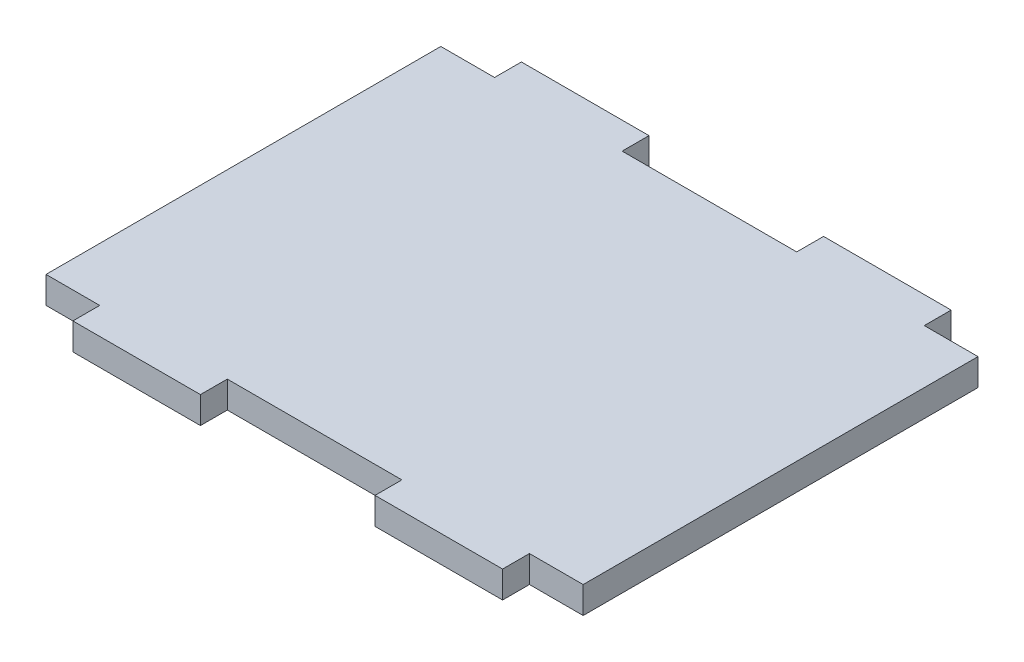
ISO-10303-21;
HEADER;
FILE_DESCRIPTION(('STEP AP214'),'2;1');
FILE_NAME('part.step','',(''),(''),'','','');
FILE_SCHEMA(('AUTOMOTIVE_DESIGN { 1 0 10303 214 1 1 1 1 }'));
ENDSEC;
DATA;
#1=APPLICATION_CONTEXT('core data for automotive mechanical design processes');
#2=APPLICATION_PROTOCOL_DEFINITION('international standard','automotive_design',2000,#1);
#3=PRODUCT_CONTEXT('',#1,'mechanical');
#4=PRODUCT('Part','Part','',(#3));
#5=PRODUCT_RELATED_PRODUCT_CATEGORY('part','',(#4));
#6=PRODUCT_DEFINITION_FORMATION('','',#4);
#7=PRODUCT_DEFINITION_CONTEXT('part definition',#1,'design');
#8=PRODUCT_DEFINITION('design','',#6,#7);
#9=PRODUCT_DEFINITION_SHAPE('','',#8);
#10=(LENGTH_UNIT() NAMED_UNIT(*) SI_UNIT(.MILLI.,.METRE.));
#11=(NAMED_UNIT(*) PLANE_ANGLE_UNIT() SI_UNIT($,.RADIAN.));
#12=(NAMED_UNIT(*) SI_UNIT($,.STERADIAN.) SOLID_ANGLE_UNIT());
#13=UNCERTAINTY_MEASURE_WITH_UNIT(LENGTH_MEASURE(1.E-05),#10,'distance_accuracy_value','');
#14=(GEOMETRIC_REPRESENTATION_CONTEXT(3) GLOBAL_UNCERTAINTY_ASSIGNED_CONTEXT((#13)) GLOBAL_UNIT_ASSIGNED_CONTEXT((#10,
#11,#12)) REPRESENTATION_CONTEXT('',''));
#15=CARTESIAN_POINT('',(0.,0.,0.));
#16=DIRECTION('',(0.,0.,1.));
#17=DIRECTION('',(1.,0.,0.));
#18=AXIS2_PLACEMENT_3D('',#15,#16,#17);
#19=CARTESIAN_POINT('',(-20.,2.,0.));
#20=DIRECTION('',(-1.,0.,0.));
#21=DIRECTION('',(0.,0.,1.));
#22=AXIS2_PLACEMENT_3D('',#19,#20,#21);
#23=PLANE('',#22);
#24=DIRECTION('',(0.,0.,-1.));
#25=VECTOR('',#24,1.);
#26=CARTESIAN_POINT('',(-20.,0.,0.));
#27=LINE('',#26,#25);
#28=CARTESIAN_POINT('',(-20.,0.,14.7));
#29=VERTEX_POINT('',#28);
#30=CARTESIAN_POINT('',(-20.,0.,-14.7));
#31=VERTEX_POINT('',#30);
#32=EDGE_CURVE('E201',#29,#31,#27,.T.);
#33=ORIENTED_EDGE('',*,*,#32,.F.);
#34=DIRECTION('',(0.,-1.,0.));
#35=VECTOR('',#34,1.);
#36=CARTESIAN_POINT('',(-20.,2.,14.7));
#37=LINE('',#36,#35);
#38=CARTESIAN_POINT('',(-20.,2.,14.7));
#39=VERTEX_POINT('',#38);
#40=EDGE_CURVE('E11',#39,#29,#37,.T.);
#41=ORIENTED_EDGE('',*,*,#40,.F.);
#42=DIRECTION('',(0.,0.,-1.));
#43=VECTOR('',#42,1.);
#44=CARTESIAN_POINT('',(-20.,2.,0.));
#45=LINE('',#44,#43);
#46=CARTESIAN_POINT('',(-20.,2.,-14.7));
#47=VERTEX_POINT('',#46);
#48=EDGE_CURVE('E305',#39,#47,#45,.T.);
#49=ORIENTED_EDGE('',*,*,#48,.T.);
#50=DIRECTION('',(0.,-1.,0.));
#51=VECTOR('',#50,1.);
#52=CARTESIAN_POINT('',(-20.,2.,-14.7));
#53=LINE('',#52,#51);
#54=EDGE_CURVE('E49',#47,#31,#53,.T.);
#55=ORIENTED_EDGE('',*,*,#54,.T.);
#56=EDGE_LOOP('',(#33,#41,#49,#55));
#57=FACE_BOUND('',#56,.T.);
#58=ADVANCED_FACE('F33',(#57),#23,.T.);
#59=CARTESIAN_POINT('',(0.,2.,14.7));
#60=DIRECTION('',(0.,0.,-1.));
#61=DIRECTION('',(-1.,0.,0.));
#62=AXIS2_PLACEMENT_3D('',#59,#60,#61);
#63=PLANE('',#62);
#64=DIRECTION('',(1.,0.,0.));
#65=VECTOR('',#64,1.);
#66=CARTESIAN_POINT('',(0.,0.,14.7));
#67=LINE('',#66,#65);
#68=CARTESIAN_POINT('',(-16.,0.,14.7));
#69=VERTEX_POINT('',#68);
#70=EDGE_CURVE('E203',#29,#69,#67,.T.);
#71=ORIENTED_EDGE('',*,*,#70,.T.);
#72=DIRECTION('',(0.,-1.,0.));
#73=VECTOR('',#72,1.);
#74=CARTESIAN_POINT('',(-16.,2.,14.7));
#75=LINE('',#74,#73);
#76=CARTESIAN_POINT('',(-16.,2.,14.7));
#77=VERTEX_POINT('',#76);
#78=EDGE_CURVE('E41',#77,#69,#75,.T.);
#79=ORIENTED_EDGE('',*,*,#78,.F.);
#80=DIRECTION('',(1.,0.,0.));
#81=VECTOR('',#80,1.);
#82=CARTESIAN_POINT('',(0.,2.,14.7));
#83=LINE('',#82,#81);
#84=EDGE_CURVE('E301',#39,#77,#83,.T.);
#85=ORIENTED_EDGE('',*,*,#84,.F.);
#86=ORIENTED_EDGE('',*,*,#40,.T.);
#87=EDGE_LOOP('',(#71,#79,#85,#86));
#88=FACE_BOUND('',#87,.T.);
#89=ADVANCED_FACE('F289',(#88),#63,.F.);
#90=CARTESIAN_POINT('',(-16.,2.,0.));
#91=DIRECTION('',(-1.,0.,0.));
#92=DIRECTION('',(0.,0.,1.));
#93=AXIS2_PLACEMENT_3D('',#90,#91,#92);
#94=PLANE('',#93);
#95=DIRECTION('',(0.,0.,-1.));
#96=VECTOR('',#95,1.);
#97=CARTESIAN_POINT('',(-16.,0.,0.));
#98=LINE('',#97,#96);
#99=CARTESIAN_POINT('',(-16.,0.,16.7));
#100=VERTEX_POINT('',#99);
#101=EDGE_CURVE('E206',#100,#69,#98,.T.);
#102=ORIENTED_EDGE('',*,*,#101,.F.);
#103=DIRECTION('',(0.,-1.,0.));
#104=VECTOR('',#103,1.);
#105=CARTESIAN_POINT('',(-16.,2.,16.7));
#106=LINE('',#105,#104);
#107=CARTESIAN_POINT('',(-16.,2.,16.7));
#108=VERTEX_POINT('',#107);
#109=EDGE_CURVE('E279',#108,#100,#106,.T.);
#110=ORIENTED_EDGE('',*,*,#109,.F.);
#111=DIRECTION('',(0.,0.,-1.));
#112=VECTOR('',#111,1.);
#113=CARTESIAN_POINT('',(-16.,2.,0.));
#114=LINE('',#113,#112);
#115=EDGE_CURVE('E286',#108,#77,#114,.T.);
#116=ORIENTED_EDGE('',*,*,#115,.T.);
#117=ORIENTED_EDGE('',*,*,#78,.T.);
#118=EDGE_LOOP('',(#102,#110,#116,#117));
#119=FACE_BOUND('',#118,.T.);
#120=ADVANCED_FACE('F284',(#119),#94,.T.);
#121=CARTESIAN_POINT('',(0.,2.,16.7));
#122=DIRECTION('',(0.,0.,1.));
#123=DIRECTION('',(1.,0.,0.));
#124=AXIS2_PLACEMENT_3D('',#121,#122,#123);
#125=PLANE('',#124);
#126=DIRECTION('',(-1.,0.,0.));
#127=VECTOR('',#126,1.);
#128=CARTESIAN_POINT('',(0.,0.,16.7));
#129=LINE('',#128,#127);
#130=CARTESIAN_POINT('',(-6.5,0.,16.7));
#131=VERTEX_POINT('',#130);
#132=EDGE_CURVE('E211',#131,#100,#129,.T.);
#133=ORIENTED_EDGE('',*,*,#132,.F.);
#134=DIRECTION('',(0.,-1.,0.));
#135=VECTOR('',#134,1.);
#136=CARTESIAN_POINT('',(-6.5,2.,16.7));
#137=LINE('',#136,#135);
#138=CARTESIAN_POINT('',(-6.5,2.,16.7));
#139=VERTEX_POINT('',#138);
#140=EDGE_CURVE('E277',#139,#131,#137,.T.);
#141=ORIENTED_EDGE('',*,*,#140,.F.);
#142=DIRECTION('',(-1.,0.,0.));
#143=VECTOR('',#142,1.);
#144=CARTESIAN_POINT('',(0.,2.,16.7));
#145=LINE('',#144,#143);
#146=EDGE_CURVE('E300',#139,#108,#145,.T.);
#147=ORIENTED_EDGE('',*,*,#146,.T.);
#148=ORIENTED_EDGE('',*,*,#109,.T.);
#149=EDGE_LOOP('',(#133,#141,#147,#148));
#150=FACE_BOUND('',#149,.T.);
#151=ADVANCED_FACE('F296',(#150),#125,.T.);
#152=CARTESIAN_POINT('',(-6.5,2.,0.));
#153=DIRECTION('',(-1.,0.,0.));
#154=DIRECTION('',(0.,0.,1.));
#155=AXIS2_PLACEMENT_3D('',#152,#153,#154);
#156=PLANE('',#155);
#157=DIRECTION('',(0.,0.,-1.));
#158=VECTOR('',#157,1.);
#159=CARTESIAN_POINT('',(-6.5,0.,0.));
#160=LINE('',#159,#158);
#161=CARTESIAN_POINT('',(-6.5,0.,14.7));
#162=VERTEX_POINT('',#161);
#163=EDGE_CURVE('E214',#131,#162,#160,.T.);
#164=ORIENTED_EDGE('',*,*,#163,.T.);
#165=DIRECTION('',(0.,-1.,0.));
#166=VECTOR('',#165,1.);
#167=CARTESIAN_POINT('',(-6.5,2.,14.7));
#168=LINE('',#167,#166);
#169=CARTESIAN_POINT('',(-6.5,2.,14.7));
#170=VERTEX_POINT('',#169);
#171=EDGE_CURVE('E274',#170,#162,#168,.T.);
#172=ORIENTED_EDGE('',*,*,#171,.F.);
#173=DIRECTION('',(0.,0.,-1.));
#174=VECTOR('',#173,1.);
#175=CARTESIAN_POINT('',(-6.5,2.,0.));
#176=LINE('',#175,#174);
#177=EDGE_CURVE('E303',#139,#170,#176,.T.);
#178=ORIENTED_EDGE('',*,*,#177,.F.);
#179=ORIENTED_EDGE('',*,*,#140,.T.);
#180=EDGE_LOOP('',(#164,#172,#178,#179));
#181=FACE_BOUND('',#180,.T.);
#182=ADVANCED_FACE('F377',(#181),#156,.F.);
#183=CARTESIAN_POINT('',(6.50000000000001,0.,14.7));
#184=VERTEX_POINT('',#183);
#185=EDGE_CURVE('E208',#162,#184,#67,.T.);
#186=ORIENTED_EDGE('',*,*,#185,.T.);
#187=DIRECTION('',(0.,-1.,0.));
#188=VECTOR('',#187,1.);
#189=CARTESIAN_POINT('',(6.50000000000001,2.,14.7));
#190=LINE('',#189,#188);
#191=CARTESIAN_POINT('',(6.50000000000001,2.,14.7));
#192=VERTEX_POINT('',#191);
#193=EDGE_CURVE('E272',#192,#184,#190,.T.);
#194=ORIENTED_EDGE('',*,*,#193,.F.);
#195=EDGE_CURVE('E308',#170,#192,#83,.T.);
#196=ORIENTED_EDGE('',*,*,#195,.F.);
#197=ORIENTED_EDGE('',*,*,#171,.T.);
#198=EDGE_LOOP('',(#186,#194,#196,#197));
#199=FACE_BOUND('',#198,.T.);
#200=ADVANCED_FACE('F368',(#199),#63,.F.);
#201=CARTESIAN_POINT('',(6.50000000000001,2.,0.));
#202=DIRECTION('',(-1.,0.,0.));
#203=DIRECTION('',(0.,0.,1.));
#204=AXIS2_PLACEMENT_3D('',#201,#202,#203);
#205=PLANE('',#204);
#206=DIRECTION('',(0.,0.,-1.));
#207=VECTOR('',#206,1.);
#208=CARTESIAN_POINT('',(6.50000000000001,0.,0.));
#209=LINE('',#208,#207);
#210=CARTESIAN_POINT('',(6.50000000000001,0.,16.7));
#211=VERTEX_POINT('',#210);
#212=EDGE_CURVE('E216',#211,#184,#209,.T.);
#213=ORIENTED_EDGE('',*,*,#212,.F.);
#214=DIRECTION('',(0.,-1.,0.));
#215=VECTOR('',#214,1.);
#216=CARTESIAN_POINT('',(6.50000000000001,2.,16.7));
#217=LINE('',#216,#215);
#218=CARTESIAN_POINT('',(6.50000000000001,2.,16.7));
#219=VERTEX_POINT('',#218);
#220=EDGE_CURVE('E270',#219,#211,#217,.T.);
#221=ORIENTED_EDGE('',*,*,#220,.F.);
#222=DIRECTION('',(0.,0.,-1.));
#223=VECTOR('',#222,1.);
#224=CARTESIAN_POINT('',(6.50000000000001,2.,0.));
#225=LINE('',#224,#223);
#226=EDGE_CURVE('E312',#219,#192,#225,.T.);
#227=ORIENTED_EDGE('',*,*,#226,.T.);
#228=ORIENTED_EDGE('',*,*,#193,.T.);
#229=EDGE_LOOP('',(#213,#221,#227,#228));
#230=FACE_BOUND('',#229,.T.);
#231=ADVANCED_FACE('F376',(#230),#205,.T.);
#232=CARTESIAN_POINT('',(0.,2.,16.7));
#233=DIRECTION('',(0.,0.,1.));
#234=DIRECTION('',(1.,0.,0.));
#235=AXIS2_PLACEMENT_3D('',#232,#233,#234);
#236=PLANE('',#235);
#237=DIRECTION('',(-1.,0.,0.));
#238=VECTOR('',#237,1.);
#239=CARTESIAN_POINT('',(0.,0.,16.7));
#240=LINE('',#239,#238);
#241=CARTESIAN_POINT('',(16.,0.,16.7));
#242=VERTEX_POINT('',#241);
#243=EDGE_CURVE('E219',#242,#211,#240,.T.);
#244=ORIENTED_EDGE('',*,*,#243,.F.);
#245=DIRECTION('',(0.,-1.,0.));
#246=VECTOR('',#245,1.);
#247=CARTESIAN_POINT('',(16.,2.,16.7));
#248=LINE('',#247,#246);
#249=CARTESIAN_POINT('',(16.,2.,16.7));
#250=VERTEX_POINT('',#249);
#251=EDGE_CURVE('E268',#250,#242,#248,.T.);
#252=ORIENTED_EDGE('',*,*,#251,.F.);
#253=DIRECTION('',(-1.,0.,0.));
#254=VECTOR('',#253,1.);
#255=CARTESIAN_POINT('',(0.,2.,16.7));
#256=LINE('',#255,#254);
#257=EDGE_CURVE('E315',#250,#219,#256,.T.);
#258=ORIENTED_EDGE('',*,*,#257,.T.);
#259=ORIENTED_EDGE('',*,*,#220,.T.);
#260=EDGE_LOOP('',(#244,#252,#258,#259));
#261=FACE_BOUND('',#260,.T.);
#262=ADVANCED_FACE('F387',(#261),#236,.T.);
#263=CARTESIAN_POINT('',(16.,2.,0.));
#264=DIRECTION('',(-1.,0.,0.));
#265=DIRECTION('',(0.,0.,1.));
#266=AXIS2_PLACEMENT_3D('',#263,#264,#265);
#267=PLANE('',#266);
#268=DIRECTION('',(0.,0.,-1.));
#269=VECTOR('',#268,1.);
#270=CARTESIAN_POINT('',(16.,0.,0.));
#271=LINE('',#270,#269);
#272=CARTESIAN_POINT('',(16.,0.,14.7));
#273=VERTEX_POINT('',#272);
#274=EDGE_CURVE('E222',#242,#273,#271,.T.);
#275=ORIENTED_EDGE('',*,*,#274,.T.);
#276=DIRECTION('',(0.,-1.,0.));
#277=VECTOR('',#276,1.);
#278=CARTESIAN_POINT('',(16.,2.,14.7));
#279=LINE('',#278,#277);
#280=CARTESIAN_POINT('',(16.,2.,14.7));
#281=VERTEX_POINT('',#280);
#282=EDGE_CURVE('E265',#281,#273,#279,.T.);
#283=ORIENTED_EDGE('',*,*,#282,.F.);
#284=DIRECTION('',(0.,0.,-1.));
#285=VECTOR('',#284,1.);
#286=CARTESIAN_POINT('',(16.,2.,0.));
#287=LINE('',#286,#285);
#288=EDGE_CURVE('E318',#250,#281,#287,.T.);
#289=ORIENTED_EDGE('',*,*,#288,.F.);
#290=ORIENTED_EDGE('',*,*,#251,.T.);
#291=EDGE_LOOP('',(#275,#283,#289,#290));
#292=FACE_BOUND('',#291,.T.);
#293=ADVANCED_FACE('F380',(#292),#267,.F.);
#294=CARTESIAN_POINT('',(20.,0.,14.7));
#295=VERTEX_POINT('',#294);
#296=EDGE_CURVE('E207',#273,#295,#67,.T.);
#297=ORIENTED_EDGE('',*,*,#296,.T.);
#298=DIRECTION('',(0.,-1.,0.));
#299=VECTOR('',#298,1.);
#300=CARTESIAN_POINT('',(20.,2.,14.7));
#301=LINE('',#300,#299);
#302=CARTESIAN_POINT('',(20.,2.,14.7));
#303=VERTEX_POINT('',#302);
#304=EDGE_CURVE('E262',#303,#295,#301,.T.);
#305=ORIENTED_EDGE('',*,*,#304,.F.);
#306=EDGE_CURVE('E307',#281,#303,#83,.T.);
#307=ORIENTED_EDGE('',*,*,#306,.F.);
#308=ORIENTED_EDGE('',*,*,#282,.T.);
#309=EDGE_LOOP('',(#297,#305,#307,#308));
#310=FACE_BOUND('',#309,.T.);
#311=ADVANCED_FACE('F369',(#310),#63,.F.);
#312=CARTESIAN_POINT('',(20.,2.,0.));
#313=DIRECTION('',(-1.,0.,0.));
#314=DIRECTION('',(0.,0.,1.));
#315=AXIS2_PLACEMENT_3D('',#312,#313,#314);
#316=PLANE('',#315);
#317=DIRECTION('',(0.,0.,-1.));
#318=VECTOR('',#317,1.);
#319=CARTESIAN_POINT('',(20.,0.,0.));
#320=LINE('',#319,#318);
#321=CARTESIAN_POINT('',(20.,0.,-14.7));
#322=VERTEX_POINT('',#321);
#323=EDGE_CURVE('E224',#295,#322,#320,.T.);
#324=ORIENTED_EDGE('',*,*,#323,.T.);
#325=DIRECTION('',(0.,-1.,0.));
#326=VECTOR('',#325,1.);
#327=CARTESIAN_POINT('',(20.,2.,-14.7));
#328=LINE('',#327,#326);
#329=CARTESIAN_POINT('',(20.,2.,-14.7));
#330=VERTEX_POINT('',#329);
#331=EDGE_CURVE('E260',#330,#322,#328,.T.);
#332=ORIENTED_EDGE('',*,*,#331,.F.);
#333=DIRECTION('',(0.,0.,-1.));
#334=VECTOR('',#333,1.);
#335=CARTESIAN_POINT('',(20.,2.,0.));
#336=LINE('',#335,#334);
#337=EDGE_CURVE('E320',#303,#330,#336,.T.);
#338=ORIENTED_EDGE('',*,*,#337,.F.);
#339=ORIENTED_EDGE('',*,*,#304,.T.);
#340=EDGE_LOOP('',(#324,#332,#338,#339));
#341=FACE_BOUND('',#340,.T.);
#342=ADVANCED_FACE('F359',(#341),#316,.F.);
#343=CARTESIAN_POINT('',(0.,2.,-14.7));
#344=DIRECTION('',(0.,0.,-1.));
#345=DIRECTION('',(-1.,0.,0.));
#346=AXIS2_PLACEMENT_3D('',#343,#344,#345);
#347=PLANE('',#346);
#348=DIRECTION('',(1.,0.,0.));
#349=VECTOR('',#348,1.);
#350=CARTESIAN_POINT('',(0.,0.,-14.7));
#351=LINE('',#350,#349);
#352=CARTESIAN_POINT('',(16.,0.,-14.7));
#353=VERTEX_POINT('',#352);
#354=EDGE_CURVE('E227',#353,#322,#351,.T.);
#355=ORIENTED_EDGE('',*,*,#354,.F.);
#356=DIRECTION('',(0.,-1.,0.));
#357=VECTOR('',#356,1.);
#358=CARTESIAN_POINT('',(16.,2.,-14.7));
#359=LINE('',#358,#357);
#360=CARTESIAN_POINT('',(16.,2.,-14.7));
#361=VERTEX_POINT('',#360);
#362=EDGE_CURVE('E258',#361,#353,#359,.T.);
#363=ORIENTED_EDGE('',*,*,#362,.F.);
#364=DIRECTION('',(1.,0.,0.));
#365=VECTOR('',#364,1.);
#366=CARTESIAN_POINT('',(0.,2.,-14.7));
#367=LINE('',#366,#365);
#368=EDGE_CURVE('E198',#361,#330,#367,.T.);
#369=ORIENTED_EDGE('',*,*,#368,.T.);
#370=ORIENTED_EDGE('',*,*,#331,.T.);
#371=EDGE_LOOP('',(#355,#363,#369,#370));
#372=FACE_BOUND('',#371,.T.);
#373=ADVANCED_FACE('F349',(#372),#347,.T.);
#374=CARTESIAN_POINT('',(16.,2.,0.));
#375=DIRECTION('',(1.,0.,0.));
#376=DIRECTION('',(0.,0.,-1.));
#377=AXIS2_PLACEMENT_3D('',#374,#375,#376);
#378=PLANE('',#377);
#379=DIRECTION('',(0.,0.,1.));
#380=VECTOR('',#379,1.);
#381=CARTESIAN_POINT('',(16.,0.,0.));
#382=LINE('',#381,#380);
#383=CARTESIAN_POINT('',(16.,0.,-16.7));
#384=VERTEX_POINT('',#383);
#385=EDGE_CURVE('E230',#384,#353,#382,.T.);
#386=ORIENTED_EDGE('',*,*,#385,.F.);
#387=DIRECTION('',(0.,-1.,0.));
#388=VECTOR('',#387,1.);
#389=CARTESIAN_POINT('',(16.,2.,-16.7));
#390=LINE('',#389,#388);
#391=CARTESIAN_POINT('',(16.,2.,-16.7));
#392=VERTEX_POINT('',#391);
#393=EDGE_CURVE('E256',#392,#384,#390,.T.);
#394=ORIENTED_EDGE('',*,*,#393,.F.);
#395=DIRECTION('',(0.,0.,1.));
#396=VECTOR('',#395,1.);
#397=CARTESIAN_POINT('',(16.,2.,0.));
#398=LINE('',#397,#396);
#399=EDGE_CURVE('E323',#392,#361,#398,.T.);
#400=ORIENTED_EDGE('',*,*,#399,.T.);
#401=ORIENTED_EDGE('',*,*,#362,.T.);
#402=EDGE_LOOP('',(#386,#394,#400,#401));
#403=FACE_BOUND('',#402,.T.);
#404=ADVANCED_FACE('F358',(#403),#378,.T.);
#405=CARTESIAN_POINT('',(0.,2.,-16.7));
#406=DIRECTION('',(0.,0.,1.));
#407=DIRECTION('',(1.,0.,0.));
#408=AXIS2_PLACEMENT_3D('',#405,#406,#407);
#409=PLANE('',#408);
#410=DIRECTION('',(-1.,0.,0.));
#411=VECTOR('',#410,1.);
#412=CARTESIAN_POINT('',(0.,0.,-16.7));
#413=LINE('',#412,#411);
#414=CARTESIAN_POINT('',(6.5,0.,-16.7));
#415=VERTEX_POINT('',#414);
#416=EDGE_CURVE('E235',#384,#415,#413,.T.);
#417=ORIENTED_EDGE('',*,*,#416,.T.);
#418=DIRECTION('',(0.,-1.,0.));
#419=VECTOR('',#418,1.);
#420=CARTESIAN_POINT('',(6.5,2.,-16.7));
#421=LINE('',#420,#419);
#422=CARTESIAN_POINT('',(6.5,2.,-16.7));
#423=VERTEX_POINT('',#422);
#424=EDGE_CURVE('E253',#423,#415,#421,.T.);
#425=ORIENTED_EDGE('',*,*,#424,.F.);
#426=DIRECTION('',(-1.,0.,0.));
#427=VECTOR('',#426,1.);
#428=CARTESIAN_POINT('',(0.,2.,-16.7));
#429=LINE('',#428,#427);
#430=EDGE_CURVE('E326',#392,#423,#429,.T.);
#431=ORIENTED_EDGE('',*,*,#430,.F.);
#432=ORIENTED_EDGE('',*,*,#393,.T.);
#433=EDGE_LOOP('',(#417,#425,#431,#432));
#434=FACE_BOUND('',#433,.T.);
#435=ADVANCED_FACE('F402',(#434),#409,.F.);
#436=CARTESIAN_POINT('',(6.5,2.,0.));
#437=DIRECTION('',(1.,0.,0.));
#438=DIRECTION('',(0.,0.,-1.));
#439=AXIS2_PLACEMENT_3D('',#436,#437,#438);
#440=PLANE('',#439);
#441=DIRECTION('',(0.,0.,1.));
#442=VECTOR('',#441,1.);
#443=CARTESIAN_POINT('',(6.5,0.,0.));
#444=LINE('',#443,#442);
#445=CARTESIAN_POINT('',(6.5,0.,-14.7));
#446=VERTEX_POINT('',#445);
#447=EDGE_CURVE('E237',#415,#446,#444,.T.);
#448=ORIENTED_EDGE('',*,*,#447,.T.);
#449=DIRECTION('',(0.,-1.,0.));
#450=VECTOR('',#449,1.);
#451=CARTESIAN_POINT('',(6.5,2.,-14.7));
#452=LINE('',#451,#450);
#453=CARTESIAN_POINT('',(6.5,2.,-14.7));
#454=VERTEX_POINT('',#453);
#455=EDGE_CURVE('E251',#454,#446,#452,.T.);
#456=ORIENTED_EDGE('',*,*,#455,.F.);
#457=DIRECTION('',(0.,0.,1.));
#458=VECTOR('',#457,1.);
#459=CARTESIAN_POINT('',(6.5,2.,0.));
#460=LINE('',#459,#458);
#461=EDGE_CURVE('E328',#423,#454,#460,.T.);
#462=ORIENTED_EDGE('',*,*,#461,.F.);
#463=ORIENTED_EDGE('',*,*,#424,.T.);
#464=EDGE_LOOP('',(#448,#456,#462,#463));
#465=FACE_BOUND('',#464,.T.);
#466=ADVANCED_FACE('F340',(#465),#440,.F.);
#467=CARTESIAN_POINT('',(-6.5,0.,-14.7));
#468=VERTEX_POINT('',#467);
#469=EDGE_CURVE('E232',#468,#446,#351,.T.);
#470=ORIENTED_EDGE('',*,*,#469,.F.);
#471=DIRECTION('',(0.,-1.,0.));
#472=VECTOR('',#471,1.);
#473=CARTESIAN_POINT('',(-6.5,2.,-14.7));
#474=LINE('',#473,#472);
#475=CARTESIAN_POINT('',(-6.5,2.,-14.7));
#476=VERTEX_POINT('',#475);
#477=EDGE_CURVE('E249',#476,#468,#474,.T.);
#478=ORIENTED_EDGE('',*,*,#477,.F.);
#479=EDGE_CURVE('E197',#476,#454,#367,.T.);
#480=ORIENTED_EDGE('',*,*,#479,.T.);
#481=ORIENTED_EDGE('',*,*,#455,.T.);
#482=EDGE_LOOP('',(#470,#478,#480,#481));
#483=FACE_BOUND('',#482,.T.);
#484=ADVANCED_FACE('F333',(#483),#347,.T.);
#485=CARTESIAN_POINT('',(-6.5,2.,0.));
#486=DIRECTION('',(1.,0.,0.));
#487=DIRECTION('',(0.,0.,-1.));
#488=AXIS2_PLACEMENT_3D('',#485,#486,#487);
#489=PLANE('',#488);
#490=DIRECTION('',(0.,0.,1.));
#491=VECTOR('',#490,1.);
#492=CARTESIAN_POINT('',(-6.5,0.,0.));
#493=LINE('',#492,#491);
#494=CARTESIAN_POINT('',(-6.5,0.,-16.7));
#495=VERTEX_POINT('',#494);
#496=EDGE_CURVE('E240',#495,#468,#493,.T.);
#497=ORIENTED_EDGE('',*,*,#496,.F.);
#498=DIRECTION('',(0.,-1.,0.));
#499=VECTOR('',#498,1.);
#500=CARTESIAN_POINT('',(-6.5,2.,-16.7));
#501=LINE('',#500,#499);
#502=CARTESIAN_POINT('',(-6.5,2.,-16.7));
#503=VERTEX_POINT('',#502);
#504=EDGE_CURVE('E191',#503,#495,#501,.T.);
#505=ORIENTED_EDGE('',*,*,#504,.F.);
#506=DIRECTION('',(0.,0.,1.));
#507=VECTOR('',#506,1.);
#508=CARTESIAN_POINT('',(-6.5,2.,0.));
#509=LINE('',#508,#507);
#510=EDGE_CURVE('E181',#503,#476,#509,.T.);
#511=ORIENTED_EDGE('',*,*,#510,.T.);
#512=ORIENTED_EDGE('',*,*,#477,.T.);
#513=EDGE_LOOP('',(#497,#505,#511,#512));
#514=FACE_BOUND('',#513,.T.);
#515=ADVANCED_FACE('F362',(#514),#489,.T.);
#516=CARTESIAN_POINT('',(0.,2.,-16.7));
#517=DIRECTION('',(0.,0.,1.));
#518=DIRECTION('',(1.,0.,0.));
#519=AXIS2_PLACEMENT_3D('',#516,#517,#518);
#520=PLANE('',#519);
#521=DIRECTION('',(-1.,0.,0.));
#522=VECTOR('',#521,1.);
#523=CARTESIAN_POINT('',(0.,0.,-16.7));
#524=LINE('',#523,#522);
#525=CARTESIAN_POINT('',(-16.,0.,-16.7));
#526=VERTEX_POINT('',#525);
#527=EDGE_CURVE('E188',#495,#526,#524,.T.);
#528=ORIENTED_EDGE('',*,*,#527,.T.);
#529=DIRECTION('',(0.,-1.,0.));
#530=VECTOR('',#529,1.);
#531=CARTESIAN_POINT('',(-16.,2.,-16.7));
#532=LINE('',#531,#530);
#533=CARTESIAN_POINT('',(-16.,2.,-16.7));
#534=VERTEX_POINT('',#533);
#535=EDGE_CURVE('E185',#534,#526,#532,.T.);
#536=ORIENTED_EDGE('',*,*,#535,.F.);
#537=DIRECTION('',(-1.,0.,0.));
#538=VECTOR('',#537,1.);
#539=CARTESIAN_POINT('',(0.,2.,-16.7));
#540=LINE('',#539,#538);
#541=EDGE_CURVE('E172',#503,#534,#540,.T.);
#542=ORIENTED_EDGE('',*,*,#541,.F.);
#543=ORIENTED_EDGE('',*,*,#504,.T.);
#544=EDGE_LOOP('',(#528,#536,#542,#543));
#545=FACE_BOUND('',#544,.T.);
#546=ADVANCED_FACE('F186',(#545),#520,.F.);
#547=CARTESIAN_POINT('',(-16.,2.,0.));
#548=DIRECTION('',(1.,0.,0.));
#549=DIRECTION('',(0.,0.,-1.));
#550=AXIS2_PLACEMENT_3D('',#547,#548,#549);
#551=PLANE('',#550);
#552=DIRECTION('',(0.,0.,1.));
#553=VECTOR('',#552,1.);
#554=CARTESIAN_POINT('',(-16.,0.,0.));
#555=LINE('',#554,#553);
#556=CARTESIAN_POINT('',(-16.,0.,-14.7));
#557=VERTEX_POINT('',#556);
#558=EDGE_CURVE('E244',#526,#557,#555,.T.);
#559=ORIENTED_EDGE('',*,*,#558,.T.);
#560=DIRECTION('',(0.,-1.,0.));
#561=VECTOR('',#560,1.);
#562=CARTESIAN_POINT('',(-16.,2.,-14.7));
#563=LINE('',#562,#561);
#564=CARTESIAN_POINT('',(-16.,2.,-14.7));
#565=VERTEX_POINT('',#564);
#566=EDGE_CURVE('E111',#565,#557,#563,.T.);
#567=ORIENTED_EDGE('',*,*,#566,.F.);
#568=DIRECTION('',(0.,0.,1.));
#569=VECTOR('',#568,1.);
#570=CARTESIAN_POINT('',(-16.,2.,0.));
#571=LINE('',#570,#569);
#572=EDGE_CURVE('E178',#534,#565,#571,.T.);
#573=ORIENTED_EDGE('',*,*,#572,.F.);
#574=ORIENTED_EDGE('',*,*,#535,.T.);
#575=EDGE_LOOP('',(#559,#567,#573,#574));
#576=FACE_BOUND('',#575,.T.);
#577=ADVANCED_FACE('F193',(#576),#551,.F.);
#578=EDGE_CURVE('E231',#31,#557,#351,.T.);
#579=ORIENTED_EDGE('',*,*,#578,.F.);
#580=ORIENTED_EDGE('',*,*,#54,.F.);
#581=EDGE_CURVE('E194',#47,#565,#367,.T.);
#582=ORIENTED_EDGE('',*,*,#581,.T.);
#583=ORIENTED_EDGE('',*,*,#566,.T.);
#584=EDGE_LOOP('',(#579,#580,#582,#583));
#585=FACE_BOUND('',#584,.T.);
#586=ADVANCED_FACE('F346',(#585),#347,.T.);
#587=CARTESIAN_POINT('',(0.,2.,0.));
#588=DIRECTION('',(0.,1.,0.));
#589=DIRECTION('',(0.,0.,1.));
#590=AXIS2_PLACEMENT_3D('',#587,#588,#589);
#591=PLANE('',#590);
#592=ORIENTED_EDGE('',*,*,#48,.F.);
#593=ORIENTED_EDGE('',*,*,#84,.T.);
#594=ORIENTED_EDGE('',*,*,#115,.F.);
#595=ORIENTED_EDGE('',*,*,#146,.F.);
#596=ORIENTED_EDGE('',*,*,#177,.T.);
#597=ORIENTED_EDGE('',*,*,#195,.T.);
#598=ORIENTED_EDGE('',*,*,#226,.F.);
#599=ORIENTED_EDGE('',*,*,#257,.F.);
#600=ORIENTED_EDGE('',*,*,#288,.T.);
#601=ORIENTED_EDGE('',*,*,#306,.T.);
#602=ORIENTED_EDGE('',*,*,#337,.T.);
#603=ORIENTED_EDGE('',*,*,#368,.F.);
#604=ORIENTED_EDGE('',*,*,#399,.F.);
#605=ORIENTED_EDGE('',*,*,#430,.T.);
#606=ORIENTED_EDGE('',*,*,#461,.T.);
#607=ORIENTED_EDGE('',*,*,#479,.F.);
#608=ORIENTED_EDGE('',*,*,#510,.F.);
#609=ORIENTED_EDGE('',*,*,#541,.T.);
#610=ORIENTED_EDGE('',*,*,#572,.T.);
#611=ORIENTED_EDGE('',*,*,#581,.F.);
#612=EDGE_LOOP('',(#592,#593,#594,#595,#596,#597,#598,#599,#600,#601,#602,#603,#604,#605,#606,
#607,#608,#609,#610,#611));
#613=FACE_BOUND('',#612,.T.);
#614=ADVANCED_FACE('F175',(#613),#591,.T.);
#615=CARTESIAN_POINT('',(0.,0.,0.));
#616=DIRECTION('',(0.,1.,0.));
#617=DIRECTION('',(0.,0.,1.));
#618=AXIS2_PLACEMENT_3D('',#615,#616,#617);
#619=PLANE('',#618);
#620=ORIENTED_EDGE('',*,*,#32,.T.);
#621=ORIENTED_EDGE('',*,*,#578,.T.);
#622=ORIENTED_EDGE('',*,*,#558,.F.);
#623=ORIENTED_EDGE('',*,*,#527,.F.);
#624=ORIENTED_EDGE('',*,*,#496,.T.);
#625=ORIENTED_EDGE('',*,*,#469,.T.);
#626=ORIENTED_EDGE('',*,*,#447,.F.);
#627=ORIENTED_EDGE('',*,*,#416,.F.);
#628=ORIENTED_EDGE('',*,*,#385,.T.);
#629=ORIENTED_EDGE('',*,*,#354,.T.);
#630=ORIENTED_EDGE('',*,*,#323,.F.);
#631=ORIENTED_EDGE('',*,*,#296,.F.);
#632=ORIENTED_EDGE('',*,*,#274,.F.);
#633=ORIENTED_EDGE('',*,*,#243,.T.);
#634=ORIENTED_EDGE('',*,*,#212,.T.);
#635=ORIENTED_EDGE('',*,*,#185,.F.);
#636=ORIENTED_EDGE('',*,*,#163,.F.);
#637=ORIENTED_EDGE('',*,*,#132,.T.);
#638=ORIENTED_EDGE('',*,*,#101,.T.);
#639=ORIENTED_EDGE('',*,*,#70,.F.);
#640=EDGE_LOOP('',(#620,#621,#622,#623,#624,#625,#626,#627,#628,#629,#630,#631,#632,#633,#634,
#635,#636,#637,#638,#639));
#641=FACE_BOUND('',#640,.T.);
#642=ADVANCED_FACE('F291',(#641),#619,.F.);
#643=CLOSED_SHELL('',(#58,#89,#120,#151,#182,#200,#231,#262,#293,#311,#342,#373,#404,#435,#466,
#484,#515,#546,#577,#586,#614,#642));
#644=MANIFOLD_SOLID_BREP('B2',#643);
#645=ADVANCED_BREP_SHAPE_REPRESENTATION('',(#18,#644),#14);
#646=SHAPE_DEFINITION_REPRESENTATION(#9,#645);
ENDSEC;
END-ISO-10303-21;
